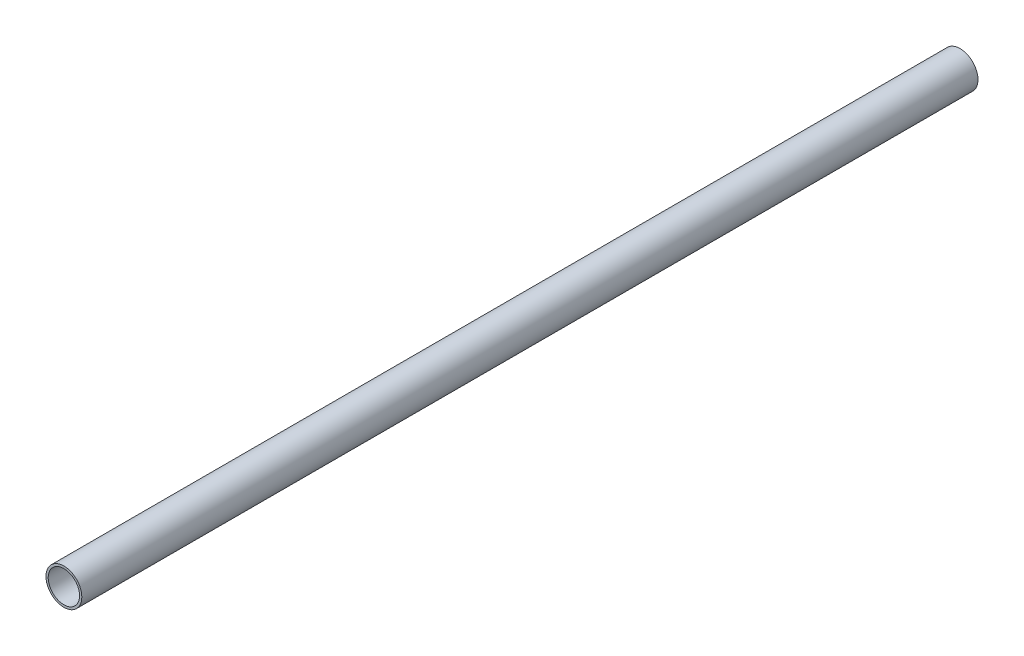
ISO-10303-21;
HEADER;
FILE_DESCRIPTION(('STEP AP214'),'2;1');
FILE_NAME('part.step','',(''),(''),'','','');
FILE_SCHEMA(('AUTOMOTIVE_DESIGN { 1 0 10303 214 1 1 1 1 }'));
ENDSEC;
DATA;
#1=APPLICATION_CONTEXT('core data for automotive mechanical design processes');
#2=APPLICATION_PROTOCOL_DEFINITION('international standard','automotive_design',2000,#1);
#3=PRODUCT_CONTEXT('',#1,'mechanical');
#4=PRODUCT('Part','Part','',(#3));
#5=PRODUCT_RELATED_PRODUCT_CATEGORY('part','',(#4));
#6=PRODUCT_DEFINITION_FORMATION('','',#4);
#7=PRODUCT_DEFINITION_CONTEXT('part definition',#1,'design');
#8=PRODUCT_DEFINITION('design','',#6,#7);
#9=PRODUCT_DEFINITION_SHAPE('','',#8);
#10=(LENGTH_UNIT() NAMED_UNIT(*) SI_UNIT(.MILLI.,.METRE.));
#11=(NAMED_UNIT(*) PLANE_ANGLE_UNIT() SI_UNIT($,.RADIAN.));
#12=(NAMED_UNIT(*) SI_UNIT($,.STERADIAN.) SOLID_ANGLE_UNIT());
#13=UNCERTAINTY_MEASURE_WITH_UNIT(LENGTH_MEASURE(1.E-05),#10,'distance_accuracy_value','');
#14=(GEOMETRIC_REPRESENTATION_CONTEXT(3) GLOBAL_UNCERTAINTY_ASSIGNED_CONTEXT((#13)) GLOBAL_UNIT_ASSIGNED_CONTEXT((#10,
#11,#12)) REPRESENTATION_CONTEXT('',''));
#15=CARTESIAN_POINT('',(0.,0.,0.));
#16=DIRECTION('',(0.,0.,1.));
#17=DIRECTION('',(1.,0.,0.));
#18=AXIS2_PLACEMENT_3D('',#15,#16,#17);
#19=CARTESIAN_POINT('',(0.,0.,200.));
#20=DIRECTION('',(0.,0.,1.));
#21=DIRECTION('',(1.,0.,0.));
#22=AXIS2_PLACEMENT_3D('',#19,#20,#21);
#23=PLANE('',#22);
#24=CARTESIAN_POINT('',(0.,0.,200.));
#25=DIRECTION('',(0.,0.,1.));
#26=DIRECTION('',(1.,0.,0.));
#27=AXIS2_PLACEMENT_3D('',#24,#25,#26);
#28=CIRCLE('',#27,8.);
#29=CARTESIAN_POINT('',(8.,0.,200.));
#30=VERTEX_POINT('',#29);
#31=EDGE_CURVE('E10',#30,#30,#28,.T.);
#32=ORIENTED_EDGE('',*,*,#31,.T.);
#33=EDGE_LOOP('',(#32));
#34=FACE_BOUND('',#33,.T.);
#35=CARTESIAN_POINT('',(0.,0.,200.));
#36=DIRECTION('',(0.,0.,1.));
#37=DIRECTION('',(1.,0.,0.));
#38=AXIS2_PLACEMENT_3D('',#35,#36,#37);
#39=CIRCLE('',#38,7.);
#40=CARTESIAN_POINT('',(7.,0.,200.));
#41=VERTEX_POINT('',#40);
#42=EDGE_CURVE('E48',#41,#41,#39,.T.);
#43=ORIENTED_EDGE('',*,*,#42,.F.);
#44=EDGE_LOOP('',(#43));
#45=FACE_BOUND('',#44,.T.);
#46=ADVANCED_FACE('F37',(#34,#45),#23,.T.);
#47=CARTESIAN_POINT('',(0.,0.,-200.));
#48=DIRECTION('',(0.,0.,1.));
#49=DIRECTION('',(1.,0.,0.));
#50=AXIS2_PLACEMENT_3D('',#47,#48,#49);
#51=PLANE('',#50);
#52=CARTESIAN_POINT('',(0.,0.,-200.));
#53=DIRECTION('',(0.,0.,1.));
#54=DIRECTION('',(1.,0.,0.));
#55=AXIS2_PLACEMENT_3D('',#52,#53,#54);
#56=CIRCLE('',#55,8.);
#57=CARTESIAN_POINT('',(8.,0.,-200.));
#58=VERTEX_POINT('',#57);
#59=EDGE_CURVE('E41',#58,#58,#56,.T.);
#60=ORIENTED_EDGE('',*,*,#59,.F.);
#61=EDGE_LOOP('',(#60));
#62=FACE_BOUND('',#61,.T.);
#63=CARTESIAN_POINT('',(0.,0.,-200.));
#64=DIRECTION('',(0.,0.,1.));
#65=DIRECTION('',(1.,0.,0.));
#66=AXIS2_PLACEMENT_3D('',#63,#64,#65);
#67=CIRCLE('',#66,7.);
#68=CARTESIAN_POINT('',(7.,0.,-200.));
#69=VERTEX_POINT('',#68);
#70=EDGE_CURVE('E50',#69,#69,#67,.T.);
#71=ORIENTED_EDGE('',*,*,#70,.T.);
#72=EDGE_LOOP('',(#71));
#73=FACE_BOUND('',#72,.T.);
#74=ADVANCED_FACE('F60',(#62,#73),#51,.F.);
#75=CARTESIAN_POINT('',(0.,0.,200.));
#76=DIRECTION('',(0.,0.,-1.));
#77=DIRECTION('',(-1.,0.,0.));
#78=AXIS2_PLACEMENT_3D('',#75,#76,#77);
#79=CYLINDRICAL_SURFACE('',#78,8.);
#80=ORIENTED_EDGE('',*,*,#31,.F.);
#81=EDGE_LOOP('',(#80));
#82=FACE_BOUND('',#81,.T.);
#83=ORIENTED_EDGE('',*,*,#59,.T.);
#84=EDGE_LOOP('',(#83));
#85=FACE_BOUND('',#84,.T.);
#86=ADVANCED_FACE('F39',(#82,#85),#79,.T.);
#87=CARTESIAN_POINT('',(0.,0.,200.));
#88=DIRECTION('',(0.,0.,-1.));
#89=DIRECTION('',(-1.,0.,0.));
#90=AXIS2_PLACEMENT_3D('',#87,#88,#89);
#91=CYLINDRICAL_SURFACE('',#90,7.);
#92=ORIENTED_EDGE('',*,*,#42,.T.);
#93=EDGE_LOOP('',(#92));
#94=FACE_BOUND('',#93,.T.);
#95=ORIENTED_EDGE('',*,*,#70,.F.);
#96=EDGE_LOOP('',(#95));
#97=FACE_BOUND('',#96,.T.);
#98=ADVANCED_FACE('F56',(#94,#97),#91,.F.);
#99=CLOSED_SHELL('',(#46,#74,#86,#98));
#100=MANIFOLD_SOLID_BREP('B2',#99);
#101=ADVANCED_BREP_SHAPE_REPRESENTATION('',(#18,#100),#14);
#102=SHAPE_DEFINITION_REPRESENTATION(#9,#101);
ENDSEC;
END-ISO-10303-21;
